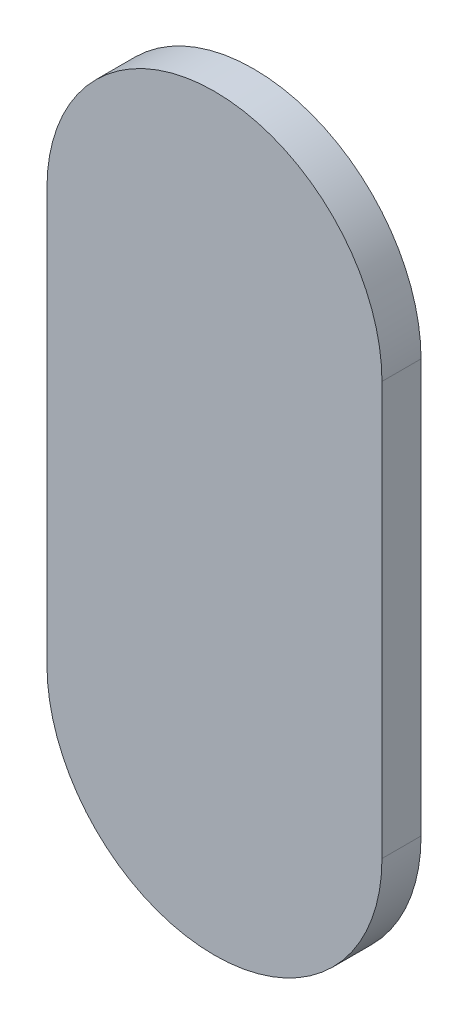
ISO-10303-21;
HEADER;
FILE_DESCRIPTION(('STEP AP214'),'2;1');
FILE_NAME('part.step','',(''),(''),'','','');
FILE_SCHEMA(('AUTOMOTIVE_DESIGN { 1 0 10303 214 1 1 1 1 }'));
ENDSEC;
DATA;
#1=APPLICATION_CONTEXT('core data for automotive mechanical design processes');
#2=APPLICATION_PROTOCOL_DEFINITION('international standard','automotive_design',2000,#1);
#3=PRODUCT_CONTEXT('',#1,'mechanical');
#4=PRODUCT('Part','Part','',(#3));
#5=PRODUCT_RELATED_PRODUCT_CATEGORY('part','',(#4));
#6=PRODUCT_DEFINITION_FORMATION('','',#4);
#7=PRODUCT_DEFINITION_CONTEXT('part definition',#1,'design');
#8=PRODUCT_DEFINITION('design','',#6,#7);
#9=PRODUCT_DEFINITION_SHAPE('','',#8);
#10=(LENGTH_UNIT() NAMED_UNIT(*) SI_UNIT(.MILLI.,.METRE.));
#11=(NAMED_UNIT(*) PLANE_ANGLE_UNIT() SI_UNIT($,.RADIAN.));
#12=(NAMED_UNIT(*) SI_UNIT($,.STERADIAN.) SOLID_ANGLE_UNIT());
#13=UNCERTAINTY_MEASURE_WITH_UNIT(LENGTH_MEASURE(1.E-05),#10,'distance_accuracy_value','');
#14=(GEOMETRIC_REPRESENTATION_CONTEXT(3) GLOBAL_UNCERTAINTY_ASSIGNED_CONTEXT((#13)) GLOBAL_UNIT_ASSIGNED_CONTEXT((#10,
#11,#12)) REPRESENTATION_CONTEXT('',''));
#15=CARTESIAN_POINT('',(0.,0.,0.));
#16=DIRECTION('',(0.,0.,1.));
#17=DIRECTION('',(1.,0.,0.));
#18=AXIS2_PLACEMENT_3D('',#15,#16,#17);
#19=CARTESIAN_POINT('',(135.14,-114.469998,1.635));
#20=DIRECTION('',(0.,0.,1.));
#21=DIRECTION('',(1.,0.,0.));
#22=AXIS2_PLACEMENT_3D('',#19,#20,#21);
#23=PLANE('',#22);
#24=DIRECTION('',(0.,1.,0.));
#25=VECTOR('',#24,1.);
#26=CARTESIAN_POINT('',(135.14,-114.469998,1.635));
#27=LINE('',#26,#25);
#28=CARTESIAN_POINT('',(135.14,-114.469998,1.635));
#29=VERTEX_POINT('',#28);
#30=CARTESIAN_POINT('',(135.14,-114.1,1.635));
#31=VERTEX_POINT('',#30);
#32=EDGE_CURVE('E98',#29,#31,#27,.T.);
#33=ORIENTED_EDGE('',*,*,#32,.T.);
#34=CARTESIAN_POINT('',(134.99,-114.1,1.635));
#35=DIRECTION('',(0.,0.,1.));
#36=DIRECTION('',(1.,0.,0.));
#37=AXIS2_PLACEMENT_3D('',#34,#35,#36);
#38=CIRCLE('',#37,0.15);
#39=CARTESIAN_POINT('',(134.84,-114.1,1.635));
#40=VERTEX_POINT('',#39);
#41=EDGE_CURVE('E77',#31,#40,#38,.T.);
#42=ORIENTED_EDGE('',*,*,#41,.T.);
#43=DIRECTION('',(0.,-1.,0.));
#44=VECTOR('',#43,1.);
#45=CARTESIAN_POINT('',(134.84,-114.1,1.635));
#46=LINE('',#45,#44);
#47=CARTESIAN_POINT('',(134.84,-114.469998,1.635));
#48=VERTEX_POINT('',#47);
#49=EDGE_CURVE('E82',#40,#48,#46,.T.);
#50=ORIENTED_EDGE('',*,*,#49,.T.);
#51=CARTESIAN_POINT('',(134.99,-114.469998,1.635));
#52=DIRECTION('',(0.,0.,1.));
#53=DIRECTION('',(-1.,0.,0.));
#54=AXIS2_PLACEMENT_3D('',#51,#52,#53);
#55=CIRCLE('',#54,0.15);
#56=EDGE_CURVE('E11',#48,#29,#55,.T.);
#57=ORIENTED_EDGE('',*,*,#56,.T.);
#58=EDGE_LOOP('',(#33,#42,#50,#57));
#59=FACE_BOUND('',#58,.T.);
#60=ADVANCED_FACE('F17',(#59),#23,.T.);
#61=CARTESIAN_POINT('',(135.14,-114.469998,1.6));
#62=DIRECTION('',(0.,0.,1.));
#63=DIRECTION('',(1.,0.,0.));
#64=AXIS2_PLACEMENT_3D('',#61,#62,#63);
#65=PLANE('',#64);
#66=CARTESIAN_POINT('',(134.99,-114.469998,1.6));
#67=DIRECTION('',(0.,0.,1.));
#68=DIRECTION('',(-1.,0.,0.));
#69=AXIS2_PLACEMENT_3D('',#66,#67,#68);
#70=CIRCLE('',#69,0.15);
#71=CARTESIAN_POINT('',(134.84,-114.469998,1.6));
#72=VERTEX_POINT('',#71);
#73=CARTESIAN_POINT('',(135.14,-114.469998,1.6));
#74=VERTEX_POINT('',#73);
#75=EDGE_CURVE('E26',#72,#74,#70,.T.);
#76=ORIENTED_EDGE('',*,*,#75,.F.);
#77=DIRECTION('',(0.,-1.,0.));
#78=VECTOR('',#77,1.);
#79=CARTESIAN_POINT('',(134.84,-114.1,1.6));
#80=LINE('',#79,#78);
#81=CARTESIAN_POINT('',(134.84,-114.1,1.6));
#82=VERTEX_POINT('',#81);
#83=EDGE_CURVE('E68',#82,#72,#80,.T.);
#84=ORIENTED_EDGE('',*,*,#83,.F.);
#85=CARTESIAN_POINT('',(134.99,-114.1,1.6));
#86=DIRECTION('',(0.,0.,1.));
#87=DIRECTION('',(1.,0.,0.));
#88=AXIS2_PLACEMENT_3D('',#85,#86,#87);
#89=CIRCLE('',#88,0.15);
#90=CARTESIAN_POINT('',(135.14,-114.1,1.6));
#91=VERTEX_POINT('',#90);
#92=EDGE_CURVE('E71',#91,#82,#89,.T.);
#93=ORIENTED_EDGE('',*,*,#92,.F.);
#94=DIRECTION('',(0.,1.,0.));
#95=VECTOR('',#94,1.);
#96=CARTESIAN_POINT('',(135.14,-114.469998,1.6));
#97=LINE('',#96,#95);
#98=EDGE_CURVE('E114',#74,#91,#97,.T.);
#99=ORIENTED_EDGE('',*,*,#98,.F.);
#100=EDGE_LOOP('',(#76,#84,#93,#99));
#101=FACE_BOUND('',#100,.T.);
#102=ADVANCED_FACE('F19',(#101),#65,.F.);
#103=CARTESIAN_POINT('',(134.99,-114.469998,1.6));
#104=DIRECTION('',(0.,0.,-1.));
#105=DIRECTION('',(-1.,0.,0.));
#106=AXIS2_PLACEMENT_3D('',#103,#104,#105);
#107=CYLINDRICAL_SURFACE('',#106,0.15);
#108=ORIENTED_EDGE('',*,*,#75,.T.);
#109=DIRECTION('',(0.,0.,1.));
#110=VECTOR('',#109,1.);
#111=CARTESIAN_POINT('',(135.14,-114.469998,1.6));
#112=LINE('',#111,#110);
#113=EDGE_CURVE('E92',#74,#29,#112,.T.);
#114=ORIENTED_EDGE('',*,*,#113,.T.);
#115=ORIENTED_EDGE('',*,*,#56,.F.);
#116=DIRECTION('',(0.,0.,1.));
#117=VECTOR('',#116,1.);
#118=CARTESIAN_POINT('',(134.84,-114.469998,1.6));
#119=LINE('',#118,#117);
#120=EDGE_CURVE('E76',#72,#48,#119,.T.);
#121=ORIENTED_EDGE('',*,*,#120,.F.);
#122=EDGE_LOOP('',(#108,#114,#115,#121));
#123=FACE_BOUND('',#122,.T.);
#124=ADVANCED_FACE('F110',(#123),#107,.T.);
#125=CARTESIAN_POINT('',(134.84,-114.1,1.6));
#126=DIRECTION('',(1.,0.,0.));
#127=DIRECTION('',(0.,1.,0.));
#128=AXIS2_PLACEMENT_3D('',#125,#126,#127);
#129=PLANE('',#128);
#130=ORIENTED_EDGE('',*,*,#83,.T.);
#131=ORIENTED_EDGE('',*,*,#120,.T.);
#132=ORIENTED_EDGE('',*,*,#49,.F.);
#133=DIRECTION('',(0.,0.,1.));
#134=VECTOR('',#133,1.);
#135=CARTESIAN_POINT('',(134.84,-114.1,1.6));
#136=LINE('',#135,#134);
#137=EDGE_CURVE('E80',#82,#40,#136,.T.);
#138=ORIENTED_EDGE('',*,*,#137,.F.);
#139=EDGE_LOOP('',(#130,#131,#132,#138));
#140=FACE_BOUND('',#139,.T.);
#141=ADVANCED_FACE('F81',(#140),#129,.F.);
#142=CARTESIAN_POINT('',(134.99,-114.1,1.6));
#143=DIRECTION('',(0.,0.,-1.));
#144=DIRECTION('',(1.,0.,0.));
#145=AXIS2_PLACEMENT_3D('',#142,#143,#144);
#146=CYLINDRICAL_SURFACE('',#145,0.15);
#147=ORIENTED_EDGE('',*,*,#92,.T.);
#148=ORIENTED_EDGE('',*,*,#137,.T.);
#149=ORIENTED_EDGE('',*,*,#41,.F.);
#150=DIRECTION('',(0.,0.,1.));
#151=VECTOR('',#150,1.);
#152=CARTESIAN_POINT('',(135.14,-114.1,1.6));
#153=LINE('',#152,#151);
#154=EDGE_CURVE('E89',#91,#31,#153,.T.);
#155=ORIENTED_EDGE('',*,*,#154,.F.);
#156=EDGE_LOOP('',(#147,#148,#149,#155));
#157=FACE_BOUND('',#156,.T.);
#158=ADVANCED_FACE('F87',(#157),#146,.T.);
#159=CARTESIAN_POINT('',(135.14,-114.469998,1.6));
#160=DIRECTION('',(-1.,0.,0.));
#161=DIRECTION('',(0.,0.,1.));
#162=AXIS2_PLACEMENT_3D('',#159,#160,#161);
#163=PLANE('',#162);
#164=ORIENTED_EDGE('',*,*,#98,.T.);
#165=ORIENTED_EDGE('',*,*,#154,.T.);
#166=ORIENTED_EDGE('',*,*,#32,.F.);
#167=ORIENTED_EDGE('',*,*,#113,.F.);
#168=EDGE_LOOP('',(#164,#165,#166,#167));
#169=FACE_BOUND('',#168,.T.);
#170=ADVANCED_FACE('F113',(#169),#163,.F.);
#171=CLOSED_SHELL('',(#60,#102,#124,#141,#158,#170));
#172=MANIFOLD_SOLID_BREP('B1',#171);
#173=ADVANCED_BREP_SHAPE_REPRESENTATION('',(#18,#172),#14);
#174=SHAPE_DEFINITION_REPRESENTATION(#9,#173);
ENDSEC;
END-ISO-10303-21;
